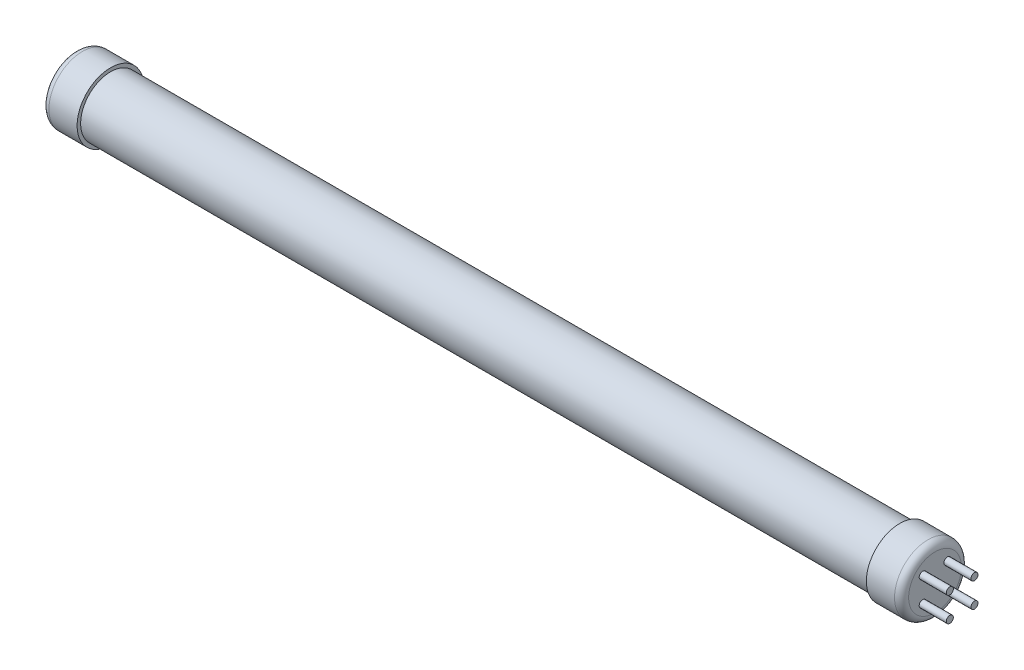
ISO-10303-21;
HEADER;
FILE_DESCRIPTION(('STEP AP214'),'2;1');
FILE_NAME('part.step','',(''),(''),'','','');
FILE_SCHEMA(('AUTOMOTIVE_DESIGN { 1 0 10303 214 1 1 1 1 }'));
ENDSEC;
DATA;
#1=APPLICATION_CONTEXT('core data for automotive mechanical design processes');
#2=APPLICATION_PROTOCOL_DEFINITION('international standard','automotive_design',2000,#1);
#3=PRODUCT_CONTEXT('',#1,'mechanical');
#4=PRODUCT('Part','Part','',(#3));
#5=PRODUCT_RELATED_PRODUCT_CATEGORY('part','',(#4));
#6=PRODUCT_DEFINITION_FORMATION('','',#4);
#7=PRODUCT_DEFINITION_CONTEXT('part definition',#1,'design');
#8=PRODUCT_DEFINITION('design','',#6,#7);
#9=PRODUCT_DEFINITION_SHAPE('','',#8);
#10=(LENGTH_UNIT() NAMED_UNIT(*) SI_UNIT(.MILLI.,.METRE.));
#11=(NAMED_UNIT(*) PLANE_ANGLE_UNIT() SI_UNIT($,.RADIAN.));
#12=(NAMED_UNIT(*) SI_UNIT($,.STERADIAN.) SOLID_ANGLE_UNIT());
#13=UNCERTAINTY_MEASURE_WITH_UNIT(LENGTH_MEASURE(1.E-05),#10,'distance_accuracy_value','');
#14=(GEOMETRIC_REPRESENTATION_CONTEXT(3) GLOBAL_UNCERTAINTY_ASSIGNED_CONTEXT((#13)) GLOBAL_UNIT_ASSIGNED_CONTEXT((#10,
#11,#12)) REPRESENTATION_CONTEXT('',''));
#15=CARTESIAN_POINT('',(0.,0.,0.));
#16=DIRECTION('',(0.,0.,1.));
#17=DIRECTION('',(1.,0.,0.));
#18=AXIS2_PLACEMENT_3D('',#15,#16,#17);
#19=CARTESIAN_POINT('',(-112.05,0.,0.));
#20=DIRECTION('',(-1.,0.,0.));
#21=DIRECTION('',(0.,0.,1.));
#22=AXIS2_PLACEMENT_3D('',#19,#20,#21);
#23=CYLINDRICAL_SURFACE('',#22,8.5);
#24=CARTESIAN_POINT('',(-112.05,0.,0.));
#25=DIRECTION('',(-1.,0.,0.));
#26=DIRECTION('',(0.,0.,1.));
#27=AXIS2_PLACEMENT_3D('',#24,#25,#26);
#28=CIRCLE('',#27,8.5);
#29=CARTESIAN_POINT('',(-112.05,0.,8.50000000000001));
#30=VERTEX_POINT('',#29);
#31=EDGE_CURVE('E53',#30,#30,#28,.T.);
#32=ORIENTED_EDGE('',*,*,#31,.F.);
#33=EDGE_LOOP('',(#32));
#34=FACE_BOUND('',#33,.T.);
#35=CARTESIAN_POINT('',(112.05,0.,0.));
#36=DIRECTION('',(-1.,0.,0.));
#37=DIRECTION('',(0.,0.,1.));
#38=AXIS2_PLACEMENT_3D('',#35,#36,#37);
#39=CIRCLE('',#38,8.5);
#40=CARTESIAN_POINT('',(112.05,0.,8.50000000000001));
#41=VERTEX_POINT('',#40);
#42=EDGE_CURVE('E57',#41,#41,#39,.T.);
#43=ORIENTED_EDGE('',*,*,#42,.T.);
#44=EDGE_LOOP('',(#43));
#45=FACE_BOUND('',#44,.T.);
#46=ADVANCED_FACE('F33',(#34,#45),#23,.T.);
#47=CARTESIAN_POINT('',(-122.05,0.,0.));
#48=DIRECTION('',(1.,0.,0.));
#49=DIRECTION('',(0.,0.,-1.));
#50=AXIS2_PLACEMENT_3D('',#47,#48,#49);
#51=CYLINDRICAL_SURFACE('',#50,9.50000000000001);
#52=CARTESIAN_POINT('',(-120.05,0.,0.));
#53=DIRECTION('',(-1.,0.,0.));
#54=DIRECTION('',(0.,0.,1.));
#55=AXIS2_PLACEMENT_3D('',#52,#53,#54);
#56=CIRCLE('',#55,9.50000000000001);
#57=CARTESIAN_POINT('',(-120.05,0.,9.50000000000001));
#58=VERTEX_POINT('',#57);
#59=EDGE_CURVE('E10',#58,#58,#56,.F.);
#60=ORIENTED_EDGE('',*,*,#59,.T.);
#61=EDGE_LOOP('',(#60));
#62=FACE_BOUND('',#61,.T.);
#63=CARTESIAN_POINT('',(-112.05,0.,0.));
#64=DIRECTION('',(-1.,0.,0.));
#65=DIRECTION('',(0.,0.,1.));
#66=AXIS2_PLACEMENT_3D('',#63,#64,#65);
#67=CIRCLE('',#66,9.50000000000001);
#68=CARTESIAN_POINT('',(-112.05,0.,9.50000000000001));
#69=VERTEX_POINT('',#68);
#70=EDGE_CURVE('E56',#69,#69,#67,.T.);
#71=ORIENTED_EDGE('',*,*,#70,.T.);
#72=EDGE_LOOP('',(#71));
#73=FACE_BOUND('',#72,.T.);
#74=ADVANCED_FACE('F131',(#62,#73),#51,.T.);
#75=CARTESIAN_POINT('',(-122.05,0.,0.));
#76=DIRECTION('',(-1.,0.,0.));
#77=DIRECTION('',(0.,0.,1.));
#78=AXIS2_PLACEMENT_3D('',#75,#76,#77);
#79=PLANE('',#78);
#80=CARTESIAN_POINT('',(-122.05,0.,0.));
#81=DIRECTION('',(-1.,0.,0.));
#82=DIRECTION('',(0.,0.,1.));
#83=AXIS2_PLACEMENT_3D('',#80,#81,#82);
#84=CIRCLE('',#83,7.50000000000001);
#85=CARTESIAN_POINT('',(-122.05,0.,7.50000000000001));
#86=VERTEX_POINT('',#85);
#87=EDGE_CURVE('E40',#86,#86,#84,.T.);
#88=ORIENTED_EDGE('',*,*,#87,.T.);
#89=EDGE_LOOP('',(#88));
#90=FACE_BOUND('',#89,.T.);
#91=ADVANCED_FACE('F137',(#90),#79,.T.);
#92=CARTESIAN_POINT('',(-112.05,0.,0.));
#93=DIRECTION('',(-1.,0.,0.));
#94=DIRECTION('',(0.,0.,1.));
#95=AXIS2_PLACEMENT_3D('',#92,#93,#94);
#96=PLANE('',#95);
#97=ORIENTED_EDGE('',*,*,#31,.T.);
#98=EDGE_LOOP('',(#97));
#99=FACE_BOUND('',#98,.T.);
#100=ORIENTED_EDGE('',*,*,#70,.F.);
#101=EDGE_LOOP('',(#100));
#102=FACE_BOUND('',#101,.T.);
#103=ADVANCED_FACE('F120',(#99,#102),#96,.F.);
#104=CARTESIAN_POINT('',(122.05,0.,0.));
#105=DIRECTION('',(-1.,0.,0.));
#106=DIRECTION('',(0.,0.,1.));
#107=AXIS2_PLACEMENT_3D('',#104,#105,#106);
#108=CYLINDRICAL_SURFACE('',#107,9.50000000000001);
#109=CARTESIAN_POINT('',(120.05,0.,0.));
#110=DIRECTION('',(1.,0.,0.));
#111=DIRECTION('',(0.,0.,-1.));
#112=AXIS2_PLACEMENT_3D('',#109,#110,#111);
#113=CIRCLE('',#112,9.50000000000001);
#114=CARTESIAN_POINT('',(120.05,0.,-9.50000000000001));
#115=VERTEX_POINT('',#114);
#116=EDGE_CURVE('E48',#115,#115,#113,.F.);
#117=ORIENTED_EDGE('',*,*,#116,.T.);
#118=EDGE_LOOP('',(#117));
#119=FACE_BOUND('',#118,.T.);
#120=CARTESIAN_POINT('',(112.05,0.,0.));
#121=DIRECTION('',(-1.,0.,0.));
#122=DIRECTION('',(0.,0.,1.));
#123=AXIS2_PLACEMENT_3D('',#120,#121,#122);
#124=CIRCLE('',#123,9.50000000000001);
#125=CARTESIAN_POINT('',(112.05,0.,9.50000000000001));
#126=VERTEX_POINT('',#125);
#127=EDGE_CURVE('E60',#126,#126,#124,.T.);
#128=ORIENTED_EDGE('',*,*,#127,.F.);
#129=EDGE_LOOP('',(#128));
#130=FACE_BOUND('',#129,.T.);
#131=ADVANCED_FACE('F103',(#119,#130),#108,.T.);
#132=CARTESIAN_POINT('',(122.05,0.,0.));
#133=DIRECTION('',(1.,0.,0.));
#134=DIRECTION('',(0.,0.,1.));
#135=AXIS2_PLACEMENT_3D('',#132,#133,#134);
#136=PLANE('',#135);
#137=CARTESIAN_POINT('',(122.05,-3.5,3.5));
#138=DIRECTION('',(1.,0.,0.));
#139=DIRECTION('',(0.,0.,-1.));
#140=AXIS2_PLACEMENT_3D('',#137,#138,#139);
#141=CIRCLE('',#140,1.);
#142=CARTESIAN_POINT('',(122.05,-3.5,4.5));
#143=VERTEX_POINT('',#142);
#144=EDGE_CURVE('E84',#143,#143,#141,.T.);
#145=ORIENTED_EDGE('',*,*,#144,.F.);
#146=EDGE_LOOP('',(#145));
#147=FACE_BOUND('',#146,.T.);
#148=CARTESIAN_POINT('',(122.05,-3.5,-3.5));
#149=DIRECTION('',(1.,0.,0.));
#150=DIRECTION('',(0.,0.,-1.));
#151=AXIS2_PLACEMENT_3D('',#148,#149,#150);
#152=CIRCLE('',#151,0.999999999999999);
#153=CARTESIAN_POINT('',(122.05,-3.5,-2.5));
#154=VERTEX_POINT('',#153);
#155=EDGE_CURVE('E78',#154,#154,#152,.T.);
#156=ORIENTED_EDGE('',*,*,#155,.F.);
#157=EDGE_LOOP('',(#156));
#158=FACE_BOUND('',#157,.T.);
#159=CARTESIAN_POINT('',(122.05,3.5,-3.5));
#160=DIRECTION('',(1.,0.,0.));
#161=DIRECTION('',(0.,0.,-1.));
#162=AXIS2_PLACEMENT_3D('',#159,#160,#161);
#163=CIRCLE('',#162,0.999999999999999);
#164=CARTESIAN_POINT('',(122.05,3.5,-2.5));
#165=VERTEX_POINT('',#164);
#166=EDGE_CURVE('E72',#165,#165,#163,.T.);
#167=ORIENTED_EDGE('',*,*,#166,.F.);
#168=EDGE_LOOP('',(#167));
#169=FACE_BOUND('',#168,.T.);
#170=CARTESIAN_POINT('',(122.05,3.5,3.5));
#171=DIRECTION('',(1.,0.,0.));
#172=DIRECTION('',(0.,0.,-1.));
#173=AXIS2_PLACEMENT_3D('',#170,#171,#172);
#174=CIRCLE('',#173,1.);
#175=CARTESIAN_POINT('',(122.05,3.5,4.5));
#176=VERTEX_POINT('',#175);
#177=EDGE_CURVE('E66',#176,#176,#174,.T.);
#178=ORIENTED_EDGE('',*,*,#177,.F.);
#179=EDGE_LOOP('',(#178));
#180=FACE_BOUND('',#179,.T.);
#181=CARTESIAN_POINT('',(122.05,0.,0.));
#182=DIRECTION('',(1.,0.,0.));
#183=DIRECTION('',(0.,0.,-1.));
#184=AXIS2_PLACEMENT_3D('',#181,#182,#183);
#185=CIRCLE('',#184,7.50000000000001);
#186=CARTESIAN_POINT('',(122.05,0.,-7.50000000000001));
#187=VERTEX_POINT('',#186);
#188=EDGE_CURVE('E44',#187,#187,#185,.T.);
#189=ORIENTED_EDGE('',*,*,#188,.T.);
#190=EDGE_LOOP('',(#189));
#191=FACE_BOUND('',#190,.T.);
#192=ADVANCED_FACE('F99',(#147,#158,#169,#180,#191),#136,.T.);
#193=CARTESIAN_POINT('',(112.05,0.,0.));
#194=DIRECTION('',(1.,0.,0.));
#195=DIRECTION('',(0.,0.,1.));
#196=AXIS2_PLACEMENT_3D('',#193,#194,#195);
#197=PLANE('',#196);
#198=ORIENTED_EDGE('',*,*,#42,.F.);
#199=EDGE_LOOP('',(#198));
#200=FACE_BOUND('',#199,.T.);
#201=ORIENTED_EDGE('',*,*,#127,.T.);
#202=EDGE_LOOP('',(#201));
#203=FACE_BOUND('',#202,.T.);
#204=ADVANCED_FACE('F102',(#200,#203),#197,.F.);
#205=CARTESIAN_POINT('',(120.05,0.,0.));
#206=DIRECTION('',(1.,0.,0.));
#207=DIRECTION('',(0.,0.,-1.));
#208=AXIS2_PLACEMENT_3D('',#205,#206,#207);
#209=TOROIDAL_SURFACE('',#208,7.50000000000001,2.);
#210=ORIENTED_EDGE('',*,*,#188,.F.);
#211=EDGE_LOOP('',(#210));
#212=FACE_BOUND('',#211,.T.);
#213=ORIENTED_EDGE('',*,*,#116,.F.);
#214=EDGE_LOOP('',(#213));
#215=FACE_BOUND('',#214,.T.);
#216=ADVANCED_FACE('F113',(#212,#215),#209,.T.);
#217=CARTESIAN_POINT('',(-120.05,0.,0.));
#218=DIRECTION('',(-1.,0.,0.));
#219=DIRECTION('',(0.,0.,1.));
#220=AXIS2_PLACEMENT_3D('',#217,#218,#219);
#221=TOROIDAL_SURFACE('',#220,7.50000000000001,2.);
#222=ORIENTED_EDGE('',*,*,#59,.F.);
#223=EDGE_LOOP('',(#222));
#224=FACE_BOUND('',#223,.T.);
#225=ORIENTED_EDGE('',*,*,#87,.F.);
#226=EDGE_LOOP('',(#225));
#227=FACE_BOUND('',#226,.T.);
#228=ADVANCED_FACE('F35',(#224,#227),#221,.T.);
#229=CARTESIAN_POINT('',(129.75,3.5,3.5));
#230=DIRECTION('',(-1.,0.,0.));
#231=DIRECTION('',(0.,0.,1.));
#232=AXIS2_PLACEMENT_3D('',#229,#230,#231);
#233=CYLINDRICAL_SURFACE('',#232,1.);
#234=CARTESIAN_POINT('',(129.75,3.5,3.5));
#235=DIRECTION('',(1.,0.,0.));
#236=DIRECTION('',(0.,0.,-1.));
#237=AXIS2_PLACEMENT_3D('',#234,#235,#236);
#238=CIRCLE('',#237,1.);
#239=CARTESIAN_POINT('',(129.75,3.5,4.5));
#240=VERTEX_POINT('',#239);
#241=EDGE_CURVE('E65',#240,#240,#238,.T.);
#242=CARTESIAN_POINT('',(129.75,3.5,4.5));
#243=CARTESIAN_POINT('',(129.669791666667,3.5,4.5));
#244=CARTESIAN_POINT('',(129.589583333333,3.5,4.5));
#245=CARTESIAN_POINT('',(129.429166666667,3.5,4.5));
#246=CARTESIAN_POINT('',(129.348958333333,3.5,4.5));
#247=CARTESIAN_POINT('',(129.188541666667,3.5,4.5));
#248=CARTESIAN_POINT('',(129.108333333333,3.5,4.5));
#249=CARTESIAN_POINT('',(128.947916666667,3.5,4.5));
#250=CARTESIAN_POINT('',(128.867708333333,3.5,4.5));
#251=CARTESIAN_POINT('',(128.707291666667,3.5,4.5));
#252=CARTESIAN_POINT('',(128.627083333333,3.5,4.5));
#253=CARTESIAN_POINT('',(128.466666666667,3.5,4.5));
#254=CARTESIAN_POINT('',(128.386458333333,3.5,4.5));
#255=CARTESIAN_POINT('',(128.226041666667,3.5,4.5));
#256=CARTESIAN_POINT('',(128.145833333333,3.5,4.5));
#257=CARTESIAN_POINT('',(127.985416666667,3.5,4.5));
#258=CARTESIAN_POINT('',(127.905208333333,3.5,4.5));
#259=CARTESIAN_POINT('',(127.744791666667,3.5,4.5));
#260=CARTESIAN_POINT('',(127.664583333333,3.5,4.5));
#261=CARTESIAN_POINT('',(127.504166666667,3.5,4.5));
#262=CARTESIAN_POINT('',(127.423958333333,3.5,4.5));
#263=CARTESIAN_POINT('',(127.263541666667,3.5,4.5));
#264=CARTESIAN_POINT('',(127.183333333333,3.5,4.5));
#265=CARTESIAN_POINT('',(127.022916666667,3.5,4.5));
#266=CARTESIAN_POINT('',(126.942708333333,3.5,4.5));
#267=CARTESIAN_POINT('',(126.782291666667,3.5,4.5));
#268=CARTESIAN_POINT('',(126.702083333333,3.5,4.5));
#269=CARTESIAN_POINT('',(126.541666666667,3.5,4.5));
#270=CARTESIAN_POINT('',(126.461458333333,3.5,4.5));
#271=CARTESIAN_POINT('',(126.301041666667,3.5,4.5));
#272=CARTESIAN_POINT('',(126.220833333333,3.5,4.5));
#273=CARTESIAN_POINT('',(126.060416666667,3.5,4.5));
#274=CARTESIAN_POINT('',(125.980208333333,3.5,4.5));
#275=CARTESIAN_POINT('',(125.819791666667,3.5,4.5));
#276=CARTESIAN_POINT('',(125.739583333333,3.5,4.5));
#277=CARTESIAN_POINT('',(125.579166666667,3.5,4.5));
#278=CARTESIAN_POINT('',(125.498958333333,3.5,4.5));
#279=CARTESIAN_POINT('',(125.338541666667,3.5,4.5));
#280=CARTESIAN_POINT('',(125.258333333333,3.5,4.5));
#281=CARTESIAN_POINT('',(125.097916666667,3.5,4.5));
#282=CARTESIAN_POINT('',(125.017708333333,3.5,4.5));
#283=CARTESIAN_POINT('',(124.857291666667,3.5,4.5));
#284=CARTESIAN_POINT('',(124.777083333333,3.5,4.5));
#285=CARTESIAN_POINT('',(124.616666666667,3.5,4.5));
#286=CARTESIAN_POINT('',(124.536458333333,3.5,4.5));
#287=CARTESIAN_POINT('',(124.376041666667,3.5,4.5));
#288=CARTESIAN_POINT('',(124.295833333333,3.5,4.5));
#289=CARTESIAN_POINT('',(124.135416666667,3.5,4.5));
#290=CARTESIAN_POINT('',(124.055208333333,3.5,4.5));
#291=CARTESIAN_POINT('',(123.894791666667,3.5,4.5));
#292=CARTESIAN_POINT('',(123.814583333333,3.5,4.5));
#293=CARTESIAN_POINT('',(123.654166666667,3.5,4.5));
#294=CARTESIAN_POINT('',(123.573958333333,3.5,4.5));
#295=CARTESIAN_POINT('',(123.413541666667,3.5,4.5));
#296=CARTESIAN_POINT('',(123.333333333333,3.5,4.5));
#297=CARTESIAN_POINT('',(123.172916666667,3.5,4.5));
#298=CARTESIAN_POINT('',(123.092708333333,3.5,4.5));
#299=CARTESIAN_POINT('',(122.932291666667,3.5,4.5));
#300=CARTESIAN_POINT('',(122.852083333333,3.5,4.5));
#301=CARTESIAN_POINT('',(122.691666666667,3.5,4.5));
#302=CARTESIAN_POINT('',(122.611458333333,3.5,4.5));
#303=CARTESIAN_POINT('',(122.451041666667,3.5,4.5));
#304=CARTESIAN_POINT('',(122.370833333333,3.5,4.5));
#305=CARTESIAN_POINT('',(122.210416666667,3.5,4.5));
#306=CARTESIAN_POINT('',(122.130208333333,3.5,4.5));
#307=CARTESIAN_POINT('',(122.05,3.5,4.5));
#308=B_SPLINE_CURVE_WITH_KNOTS('',3,(#242,#243,#244,#245,#246,#247,#248,#249,#250,#251,#252,
#253,#254,#255,#256,#257,#258,#259,#260,#261,#262,#263,#264,#265,#266,#267,#268,#269,#270,#271,
#272,#273,#274,#275,#276,#277,#278,#279,#280,#281,#282,#283,#284,#285,#286,#287,#288,#289,#290,
#291,#292,#293,#294,#295,#296,#297,#298,#299,#300,#301,#302,#303,#304,#305,#306,#307),
.UNSPECIFIED.,.F.,.F.,(4,2,2,2,2,2,2,2,2,2,2,2,2,2,2,2,2,2,2,2,2,2,2,2,2,2,2,2,2,2,2,2,4),(0.,
0.240624999999994,0.481249999999989,0.721874999999983,0.962499999999977,1.203125,
1.44374999999999,1.68437499999999,1.92499999999998,2.16562499999998,2.40625,2.64687499999999,
2.88749999999999,3.12812499999998,3.36874999999998,3.609375,3.84999999999999,4.09062499999999,
4.33124999999998,4.571875,4.81249999999998,5.05312499999999,5.29374999999999,5.53437499999999,
5.77499999999999,6.015625,6.25624999999999,6.49687499999999,6.73749999999999,6.97812499999999,
7.21875,7.45937499999999,7.7),.UNSPECIFIED.);
#309=EDGE_CURVE('BSEAM200',#240,#176,#308,.T.);
#310=ORIENTED_EDGE('',*,*,#241,.F.);
#311=ORIENTED_EDGE('',*,*,#177,.T.);
#312=ORIENTED_EDGE('',*,*,#309,.T.);
#313=ORIENTED_EDGE('',*,*,#309,.F.);
#314=EDGE_LOOP('',(#310,#312,#311,#313));
#315=FACE_BOUND('',#314,.T.);
#316=ADVANCED_FACE('F200',(#315),#233,.T.);
#317=CARTESIAN_POINT('',(129.75,3.5,3.5));
#318=DIRECTION('',(1.,0.,0.));
#319=DIRECTION('',(0.,0.,-1.));
#320=AXIS2_PLACEMENT_3D('',#317,#318,#319);
#321=PLANE('',#320);
#322=ORIENTED_EDGE('',*,*,#241,.T.);
#323=EDGE_LOOP('',(#322));
#324=FACE_BOUND('',#323,.T.);
#325=ADVANCED_FACE('F209',(#324),#321,.T.);
#326=CARTESIAN_POINT('',(129.75,3.5,-3.5));
#327=DIRECTION('',(-1.,0.,0.));
#328=DIRECTION('',(0.,0.,1.));
#329=AXIS2_PLACEMENT_3D('',#326,#327,#328);
#330=CYLINDRICAL_SURFACE('',#329,0.999999999999999);
#331=CARTESIAN_POINT('',(129.75,3.5,-3.5));
#332=DIRECTION('',(1.,0.,0.));
#333=DIRECTION('',(0.,0.,-1.));
#334=AXIS2_PLACEMENT_3D('',#331,#332,#333);
#335=CIRCLE('',#334,0.999999999999999);
#336=CARTESIAN_POINT('',(129.75,3.5,-2.5));
#337=VERTEX_POINT('',#336);
#338=EDGE_CURVE('E69',#337,#337,#335,.T.);
#339=CARTESIAN_POINT('',(129.75,3.5,-2.5));
#340=CARTESIAN_POINT('',(129.669791666667,3.5,-2.5));
#341=CARTESIAN_POINT('',(129.589583333333,3.5,-2.5));
#342=CARTESIAN_POINT('',(129.429166666667,3.5,-2.5));
#343=CARTESIAN_POINT('',(129.348958333333,3.5,-2.5));
#344=CARTESIAN_POINT('',(129.188541666667,3.5,-2.5));
#345=CARTESIAN_POINT('',(129.108333333333,3.5,-2.5));
#346=CARTESIAN_POINT('',(128.947916666667,3.5,-2.5));
#347=CARTESIAN_POINT('',(128.867708333333,3.5,-2.5));
#348=CARTESIAN_POINT('',(128.707291666667,3.5,-2.5));
#349=CARTESIAN_POINT('',(128.627083333333,3.5,-2.5));
#350=CARTESIAN_POINT('',(128.466666666667,3.5,-2.5));
#351=CARTESIAN_POINT('',(128.386458333333,3.5,-2.5));
#352=CARTESIAN_POINT('',(128.226041666667,3.5,-2.5));
#353=CARTESIAN_POINT('',(128.145833333333,3.5,-2.5));
#354=CARTESIAN_POINT('',(127.985416666667,3.5,-2.5));
#355=CARTESIAN_POINT('',(127.905208333333,3.5,-2.5));
#356=CARTESIAN_POINT('',(127.744791666667,3.5,-2.5));
#357=CARTESIAN_POINT('',(127.664583333333,3.5,-2.5));
#358=CARTESIAN_POINT('',(127.504166666667,3.5,-2.5));
#359=CARTESIAN_POINT('',(127.423958333333,3.5,-2.5));
#360=CARTESIAN_POINT('',(127.263541666667,3.5,-2.5));
#361=CARTESIAN_POINT('',(127.183333333333,3.5,-2.5));
#362=CARTESIAN_POINT('',(127.022916666667,3.5,-2.5));
#363=CARTESIAN_POINT('',(126.942708333333,3.5,-2.5));
#364=CARTESIAN_POINT('',(126.782291666667,3.5,-2.5));
#365=CARTESIAN_POINT('',(126.702083333333,3.5,-2.5));
#366=CARTESIAN_POINT('',(126.541666666667,3.5,-2.5));
#367=CARTESIAN_POINT('',(126.461458333333,3.5,-2.5));
#368=CARTESIAN_POINT('',(126.301041666667,3.5,-2.5));
#369=CARTESIAN_POINT('',(126.220833333333,3.5,-2.5));
#370=CARTESIAN_POINT('',(126.060416666667,3.5,-2.5));
#371=CARTESIAN_POINT('',(125.980208333333,3.5,-2.5));
#372=CARTESIAN_POINT('',(125.819791666667,3.5,-2.5));
#373=CARTESIAN_POINT('',(125.739583333333,3.5,-2.5));
#374=CARTESIAN_POINT('',(125.579166666667,3.5,-2.5));
#375=CARTESIAN_POINT('',(125.498958333333,3.5,-2.5));
#376=CARTESIAN_POINT('',(125.338541666667,3.5,-2.5));
#377=CARTESIAN_POINT('',(125.258333333333,3.5,-2.5));
#378=CARTESIAN_POINT('',(125.097916666667,3.5,-2.5));
#379=CARTESIAN_POINT('',(125.017708333333,3.5,-2.5));
#380=CARTESIAN_POINT('',(124.857291666667,3.5,-2.5));
#381=CARTESIAN_POINT('',(124.777083333333,3.5,-2.5));
#382=CARTESIAN_POINT('',(124.616666666667,3.5,-2.5));
#383=CARTESIAN_POINT('',(124.536458333333,3.5,-2.5));
#384=CARTESIAN_POINT('',(124.376041666667,3.5,-2.5));
#385=CARTESIAN_POINT('',(124.295833333333,3.5,-2.5));
#386=CARTESIAN_POINT('',(124.135416666667,3.5,-2.5));
#387=CARTESIAN_POINT('',(124.055208333333,3.5,-2.5));
#388=CARTESIAN_POINT('',(123.894791666667,3.5,-2.5));
#389=CARTESIAN_POINT('',(123.814583333333,3.5,-2.5));
#390=CARTESIAN_POINT('',(123.654166666667,3.5,-2.5));
#391=CARTESIAN_POINT('',(123.573958333333,3.5,-2.5));
#392=CARTESIAN_POINT('',(123.413541666667,3.5,-2.5));
#393=CARTESIAN_POINT('',(123.333333333333,3.5,-2.5));
#394=CARTESIAN_POINT('',(123.172916666667,3.5,-2.5));
#395=CARTESIAN_POINT('',(123.092708333333,3.5,-2.5));
#396=CARTESIAN_POINT('',(122.932291666667,3.5,-2.5));
#397=CARTESIAN_POINT('',(122.852083333333,3.5,-2.5));
#398=CARTESIAN_POINT('',(122.691666666667,3.5,-2.5));
#399=CARTESIAN_POINT('',(122.611458333333,3.5,-2.5));
#400=CARTESIAN_POINT('',(122.451041666667,3.5,-2.5));
#401=CARTESIAN_POINT('',(122.370833333333,3.5,-2.5));
#402=CARTESIAN_POINT('',(122.210416666667,3.5,-2.5));
#403=CARTESIAN_POINT('',(122.130208333333,3.5,-2.5));
#404=CARTESIAN_POINT('',(122.05,3.5,-2.5));
#405=B_SPLINE_CURVE_WITH_KNOTS('',3,(#339,#340,#341,#342,#343,#344,#345,#346,#347,#348,#349,
#350,#351,#352,#353,#354,#355,#356,#357,#358,#359,#360,#361,#362,#363,#364,#365,#366,#367,#368,
#369,#370,#371,#372,#373,#374,#375,#376,#377,#378,#379,#380,#381,#382,#383,#384,#385,#386,#387,
#388,#389,#390,#391,#392,#393,#394,#395,#396,#397,#398,#399,#400,#401,#402,#403,#404),
.UNSPECIFIED.,.F.,.F.,(4,2,2,2,2,2,2,2,2,2,2,2,2,2,2,2,2,2,2,2,2,2,2,2,2,2,2,2,2,2,2,2,4),(0.,
0.240624999999994,0.481249999999989,0.721874999999983,0.962499999999977,1.203125,
1.44374999999999,1.68437499999999,1.92499999999998,2.16562499999998,2.40625,2.64687499999999,
2.88749999999999,3.12812499999998,3.36874999999998,3.609375,3.84999999999999,4.09062499999999,
4.33124999999998,4.571875,4.81249999999998,5.05312499999999,5.29374999999999,5.53437499999999,
5.77499999999999,6.015625,6.25624999999999,6.49687499999999,6.73749999999999,6.97812499999999,
7.21875,7.45937499999999,7.7),.UNSPECIFIED.);
#406=EDGE_CURVE('BSEAM216',#337,#165,#405,.T.);
#407=ORIENTED_EDGE('',*,*,#338,.F.);
#408=ORIENTED_EDGE('',*,*,#166,.T.);
#409=ORIENTED_EDGE('',*,*,#406,.T.);
#410=ORIENTED_EDGE('',*,*,#406,.F.);
#411=EDGE_LOOP('',(#407,#409,#408,#410));
#412=FACE_BOUND('',#411,.T.);
#413=ADVANCED_FACE('F216',(#412),#330,.T.);
#414=CARTESIAN_POINT('',(129.75,3.5,-3.5));
#415=DIRECTION('',(1.,0.,0.));
#416=DIRECTION('',(0.,0.,-1.));
#417=AXIS2_PLACEMENT_3D('',#414,#415,#416);
#418=PLANE('',#417);
#419=ORIENTED_EDGE('',*,*,#338,.T.);
#420=EDGE_LOOP('',(#419));
#421=FACE_BOUND('',#420,.T.);
#422=ADVANCED_FACE('F224',(#421),#418,.T.);
#423=CARTESIAN_POINT('',(129.75,-3.5,-3.5));
#424=DIRECTION('',(-1.,0.,0.));
#425=DIRECTION('',(0.,0.,1.));
#426=AXIS2_PLACEMENT_3D('',#423,#424,#425);
#427=CYLINDRICAL_SURFACE('',#426,0.999999999999999);
#428=CARTESIAN_POINT('',(129.75,-3.5,-3.5));
#429=DIRECTION('',(1.,0.,0.));
#430=DIRECTION('',(0.,0.,-1.));
#431=AXIS2_PLACEMENT_3D('',#428,#429,#430);
#432=CIRCLE('',#431,0.999999999999999);
#433=CARTESIAN_POINT('',(129.75,-3.5,-2.5));
#434=VERTEX_POINT('',#433);
#435=EDGE_CURVE('E75',#434,#434,#432,.T.);
#436=CARTESIAN_POINT('',(129.75,-3.5,-2.5));
#437=CARTESIAN_POINT('',(129.669791666667,-3.5,-2.5));
#438=CARTESIAN_POINT('',(129.589583333333,-3.5,-2.5));
#439=CARTESIAN_POINT('',(129.429166666667,-3.5,-2.5));
#440=CARTESIAN_POINT('',(129.348958333333,-3.5,-2.5));
#441=CARTESIAN_POINT('',(129.188541666667,-3.5,-2.5));
#442=CARTESIAN_POINT('',(129.108333333333,-3.5,-2.5));
#443=CARTESIAN_POINT('',(128.947916666667,-3.5,-2.5));
#444=CARTESIAN_POINT('',(128.867708333333,-3.5,-2.5));
#445=CARTESIAN_POINT('',(128.707291666667,-3.5,-2.5));
#446=CARTESIAN_POINT('',(128.627083333333,-3.5,-2.5));
#447=CARTESIAN_POINT('',(128.466666666667,-3.5,-2.5));
#448=CARTESIAN_POINT('',(128.386458333333,-3.5,-2.5));
#449=CARTESIAN_POINT('',(128.226041666667,-3.5,-2.5));
#450=CARTESIAN_POINT('',(128.145833333333,-3.5,-2.5));
#451=CARTESIAN_POINT('',(127.985416666667,-3.5,-2.5));
#452=CARTESIAN_POINT('',(127.905208333333,-3.5,-2.5));
#453=CARTESIAN_POINT('',(127.744791666667,-3.5,-2.5));
#454=CARTESIAN_POINT('',(127.664583333333,-3.5,-2.5));
#455=CARTESIAN_POINT('',(127.504166666667,-3.5,-2.5));
#456=CARTESIAN_POINT('',(127.423958333333,-3.5,-2.5));
#457=CARTESIAN_POINT('',(127.263541666667,-3.5,-2.5));
#458=CARTESIAN_POINT('',(127.183333333333,-3.5,-2.5));
#459=CARTESIAN_POINT('',(127.022916666667,-3.5,-2.5));
#460=CARTESIAN_POINT('',(126.942708333333,-3.5,-2.5));
#461=CARTESIAN_POINT('',(126.782291666667,-3.5,-2.5));
#462=CARTESIAN_POINT('',(126.702083333333,-3.5,-2.5));
#463=CARTESIAN_POINT('',(126.541666666667,-3.5,-2.5));
#464=CARTESIAN_POINT('',(126.461458333333,-3.5,-2.5));
#465=CARTESIAN_POINT('',(126.301041666667,-3.5,-2.5));
#466=CARTESIAN_POINT('',(126.220833333333,-3.5,-2.5));
#467=CARTESIAN_POINT('',(126.060416666667,-3.5,-2.5));
#468=CARTESIAN_POINT('',(125.980208333333,-3.5,-2.5));
#469=CARTESIAN_POINT('',(125.819791666667,-3.5,-2.5));
#470=CARTESIAN_POINT('',(125.739583333333,-3.5,-2.5));
#471=CARTESIAN_POINT('',(125.579166666667,-3.5,-2.5));
#472=CARTESIAN_POINT('',(125.498958333333,-3.5,-2.5));
#473=CARTESIAN_POINT('',(125.338541666667,-3.5,-2.5));
#474=CARTESIAN_POINT('',(125.258333333333,-3.5,-2.5));
#475=CARTESIAN_POINT('',(125.097916666667,-3.5,-2.5));
#476=CARTESIAN_POINT('',(125.017708333333,-3.5,-2.5));
#477=CARTESIAN_POINT('',(124.857291666667,-3.5,-2.5));
#478=CARTESIAN_POINT('',(124.777083333333,-3.5,-2.5));
#479=CARTESIAN_POINT('',(124.616666666667,-3.5,-2.5));
#480=CARTESIAN_POINT('',(124.536458333333,-3.5,-2.5));
#481=CARTESIAN_POINT('',(124.376041666667,-3.5,-2.5));
#482=CARTESIAN_POINT('',(124.295833333333,-3.5,-2.5));
#483=CARTESIAN_POINT('',(124.135416666667,-3.5,-2.5));
#484=CARTESIAN_POINT('',(124.055208333333,-3.5,-2.5));
#485=CARTESIAN_POINT('',(123.894791666667,-3.5,-2.5));
#486=CARTESIAN_POINT('',(123.814583333333,-3.5,-2.5));
#487=CARTESIAN_POINT('',(123.654166666667,-3.5,-2.5));
#488=CARTESIAN_POINT('',(123.573958333333,-3.5,-2.5));
#489=CARTESIAN_POINT('',(123.413541666667,-3.5,-2.5));
#490=CARTESIAN_POINT('',(123.333333333333,-3.5,-2.5));
#491=CARTESIAN_POINT('',(123.172916666667,-3.5,-2.5));
#492=CARTESIAN_POINT('',(123.092708333333,-3.5,-2.5));
#493=CARTESIAN_POINT('',(122.932291666667,-3.5,-2.5));
#494=CARTESIAN_POINT('',(122.852083333333,-3.5,-2.5));
#495=CARTESIAN_POINT('',(122.691666666667,-3.5,-2.5));
#496=CARTESIAN_POINT('',(122.611458333333,-3.5,-2.5));
#497=CARTESIAN_POINT('',(122.451041666667,-3.5,-2.5));
#498=CARTESIAN_POINT('',(122.370833333333,-3.5,-2.5));
#499=CARTESIAN_POINT('',(122.210416666667,-3.5,-2.5));
#500=CARTESIAN_POINT('',(122.130208333333,-3.5,-2.5));
#501=CARTESIAN_POINT('',(122.05,-3.5,-2.5));
#502=B_SPLINE_CURVE_WITH_KNOTS('',3,(#436,#437,#438,#439,#440,#441,#442,#443,#444,#445,#446,
#447,#448,#449,#450,#451,#452,#453,#454,#455,#456,#457,#458,#459,#460,#461,#462,#463,#464,#465,
#466,#467,#468,#469,#470,#471,#472,#473,#474,#475,#476,#477,#478,#479,#480,#481,#482,#483,#484,
#485,#486,#487,#488,#489,#490,#491,#492,#493,#494,#495,#496,#497,#498,#499,#500,#501),
.UNSPECIFIED.,.F.,.F.,(4,2,2,2,2,2,2,2,2,2,2,2,2,2,2,2,2,2,2,2,2,2,2,2,2,2,2,2,2,2,2,2,4),(0.,
0.240624999999994,0.481249999999989,0.721874999999983,0.962499999999977,1.203125,
1.44374999999999,1.68437499999999,1.92499999999998,2.16562499999998,2.40625,2.64687499999999,
2.88749999999999,3.12812499999998,3.36874999999998,3.609375,3.84999999999999,4.09062499999999,
4.33124999999998,4.571875,4.81249999999998,5.05312499999999,5.29374999999999,5.53437499999999,
5.77499999999999,6.015625,6.25624999999999,6.49687499999999,6.73749999999999,6.97812499999999,
7.21875,7.45937499999999,7.7),.UNSPECIFIED.);
#503=EDGE_CURVE('BSEAM232',#434,#154,#502,.T.);
#504=ORIENTED_EDGE('',*,*,#435,.F.);
#505=ORIENTED_EDGE('',*,*,#155,.T.);
#506=ORIENTED_EDGE('',*,*,#503,.T.);
#507=ORIENTED_EDGE('',*,*,#503,.F.);
#508=EDGE_LOOP('',(#504,#506,#505,#507));
#509=FACE_BOUND('',#508,.T.);
#510=ADVANCED_FACE('F232',(#509),#427,.T.);
#511=CARTESIAN_POINT('',(129.75,-3.5,-3.5));
#512=DIRECTION('',(1.,0.,0.));
#513=DIRECTION('',(0.,0.,-1.));
#514=AXIS2_PLACEMENT_3D('',#511,#512,#513);
#515=PLANE('',#514);
#516=ORIENTED_EDGE('',*,*,#435,.T.);
#517=EDGE_LOOP('',(#516));
#518=FACE_BOUND('',#517,.T.);
#519=ADVANCED_FACE('F95',(#518),#515,.T.);
#520=CARTESIAN_POINT('',(129.75,-3.5,3.5));
#521=DIRECTION('',(-1.,0.,0.));
#522=DIRECTION('',(0.,0.,1.));
#523=AXIS2_PLACEMENT_3D('',#520,#521,#522);
#524=CYLINDRICAL_SURFACE('',#523,1.);
#525=CARTESIAN_POINT('',(129.75,-3.5,3.5));
#526=DIRECTION('',(1.,0.,0.));
#527=DIRECTION('',(0.,0.,-1.));
#528=AXIS2_PLACEMENT_3D('',#525,#526,#527);
#529=CIRCLE('',#528,1.);
#530=CARTESIAN_POINT('',(129.75,-3.5,4.5));
#531=VERTEX_POINT('',#530);
#532=EDGE_CURVE('E81',#531,#531,#529,.T.);
#533=CARTESIAN_POINT('',(129.75,-3.5,4.5));
#534=CARTESIAN_POINT('',(129.669791666667,-3.5,4.5));
#535=CARTESIAN_POINT('',(129.589583333333,-3.5,4.5));
#536=CARTESIAN_POINT('',(129.429166666667,-3.5,4.5));
#537=CARTESIAN_POINT('',(129.348958333333,-3.5,4.5));
#538=CARTESIAN_POINT('',(129.188541666667,-3.5,4.5));
#539=CARTESIAN_POINT('',(129.108333333333,-3.5,4.5));
#540=CARTESIAN_POINT('',(128.947916666667,-3.5,4.5));
#541=CARTESIAN_POINT('',(128.867708333333,-3.5,4.5));
#542=CARTESIAN_POINT('',(128.707291666667,-3.5,4.5));
#543=CARTESIAN_POINT('',(128.627083333333,-3.5,4.5));
#544=CARTESIAN_POINT('',(128.466666666667,-3.5,4.5));
#545=CARTESIAN_POINT('',(128.386458333333,-3.5,4.5));
#546=CARTESIAN_POINT('',(128.226041666667,-3.5,4.5));
#547=CARTESIAN_POINT('',(128.145833333333,-3.5,4.5));
#548=CARTESIAN_POINT('',(127.985416666667,-3.5,4.5));
#549=CARTESIAN_POINT('',(127.905208333333,-3.5,4.5));
#550=CARTESIAN_POINT('',(127.744791666667,-3.5,4.5));
#551=CARTESIAN_POINT('',(127.664583333333,-3.5,4.5));
#552=CARTESIAN_POINT('',(127.504166666667,-3.5,4.5));
#553=CARTESIAN_POINT('',(127.423958333333,-3.5,4.5));
#554=CARTESIAN_POINT('',(127.263541666667,-3.5,4.5));
#555=CARTESIAN_POINT('',(127.183333333333,-3.5,4.5));
#556=CARTESIAN_POINT('',(127.022916666667,-3.5,4.5));
#557=CARTESIAN_POINT('',(126.942708333333,-3.5,4.5));
#558=CARTESIAN_POINT('',(126.782291666667,-3.5,4.5));
#559=CARTESIAN_POINT('',(126.702083333333,-3.5,4.5));
#560=CARTESIAN_POINT('',(126.541666666667,-3.5,4.5));
#561=CARTESIAN_POINT('',(126.461458333333,-3.5,4.5));
#562=CARTESIAN_POINT('',(126.301041666667,-3.5,4.5));
#563=CARTESIAN_POINT('',(126.220833333333,-3.5,4.5));
#564=CARTESIAN_POINT('',(126.060416666667,-3.5,4.5));
#565=CARTESIAN_POINT('',(125.980208333333,-3.5,4.5));
#566=CARTESIAN_POINT('',(125.819791666667,-3.5,4.5));
#567=CARTESIAN_POINT('',(125.739583333333,-3.5,4.5));
#568=CARTESIAN_POINT('',(125.579166666667,-3.5,4.5));
#569=CARTESIAN_POINT('',(125.498958333333,-3.5,4.5));
#570=CARTESIAN_POINT('',(125.338541666667,-3.5,4.5));
#571=CARTESIAN_POINT('',(125.258333333333,-3.5,4.5));
#572=CARTESIAN_POINT('',(125.097916666667,-3.5,4.5));
#573=CARTESIAN_POINT('',(125.017708333333,-3.5,4.5));
#574=CARTESIAN_POINT('',(124.857291666667,-3.5,4.5));
#575=CARTESIAN_POINT('',(124.777083333333,-3.5,4.5));
#576=CARTESIAN_POINT('',(124.616666666667,-3.5,4.5));
#577=CARTESIAN_POINT('',(124.536458333333,-3.5,4.5));
#578=CARTESIAN_POINT('',(124.376041666667,-3.5,4.5));
#579=CARTESIAN_POINT('',(124.295833333333,-3.5,4.5));
#580=CARTESIAN_POINT('',(124.135416666667,-3.5,4.5));
#581=CARTESIAN_POINT('',(124.055208333333,-3.5,4.5));
#582=CARTESIAN_POINT('',(123.894791666667,-3.5,4.5));
#583=CARTESIAN_POINT('',(123.814583333333,-3.5,4.5));
#584=CARTESIAN_POINT('',(123.654166666667,-3.5,4.5));
#585=CARTESIAN_POINT('',(123.573958333333,-3.5,4.5));
#586=CARTESIAN_POINT('',(123.413541666667,-3.5,4.5));
#587=CARTESIAN_POINT('',(123.333333333333,-3.5,4.5));
#588=CARTESIAN_POINT('',(123.172916666667,-3.5,4.5));
#589=CARTESIAN_POINT('',(123.092708333333,-3.5,4.5));
#590=CARTESIAN_POINT('',(122.932291666667,-3.5,4.5));
#591=CARTESIAN_POINT('',(122.852083333333,-3.5,4.5));
#592=CARTESIAN_POINT('',(122.691666666667,-3.5,4.5));
#593=CARTESIAN_POINT('',(122.611458333333,-3.5,4.5));
#594=CARTESIAN_POINT('',(122.451041666667,-3.5,4.5));
#595=CARTESIAN_POINT('',(122.370833333333,-3.5,4.5));
#596=CARTESIAN_POINT('',(122.210416666667,-3.5,4.5));
#597=CARTESIAN_POINT('',(122.130208333333,-3.5,4.5));
#598=CARTESIAN_POINT('',(122.05,-3.5,4.5));
#599=B_SPLINE_CURVE_WITH_KNOTS('',3,(#533,#534,#535,#536,#537,#538,#539,#540,#541,#542,#543,
#544,#545,#546,#547,#548,#549,#550,#551,#552,#553,#554,#555,#556,#557,#558,#559,#560,#561,#562,
#563,#564,#565,#566,#567,#568,#569,#570,#571,#572,#573,#574,#575,#576,#577,#578,#579,#580,#581,
#582,#583,#584,#585,#586,#587,#588,#589,#590,#591,#592,#593,#594,#595,#596,#597,#598),
.UNSPECIFIED.,.F.,.F.,(4,2,2,2,2,2,2,2,2,2,2,2,2,2,2,2,2,2,2,2,2,2,2,2,2,2,2,2,2,2,2,2,4),(0.,
0.240624999999994,0.481249999999989,0.721874999999983,0.962499999999977,1.203125,
1.44374999999999,1.68437499999999,1.92499999999998,2.16562499999998,2.40625,2.64687499999999,
2.88749999999999,3.12812499999998,3.36874999999998,3.609375,3.84999999999999,4.09062499999999,
4.33124999999998,4.571875,4.81249999999998,5.05312499999999,5.29374999999999,5.53437499999999,
5.77499999999999,6.015625,6.25624999999999,6.49687499999999,6.73749999999999,6.97812499999999,
7.21875,7.45937499999999,7.7),.UNSPECIFIED.);
#600=EDGE_CURVE('BSEAM92',#531,#143,#599,.T.);
#601=ORIENTED_EDGE('',*,*,#532,.F.);
#602=ORIENTED_EDGE('',*,*,#144,.T.);
#603=ORIENTED_EDGE('',*,*,#600,.T.);
#604=ORIENTED_EDGE('',*,*,#600,.F.);
#605=EDGE_LOOP('',(#601,#603,#602,#604));
#606=FACE_BOUND('',#605,.T.);
#607=ADVANCED_FACE('F92',(#606),#524,.T.);
#608=CARTESIAN_POINT('',(129.75,-3.5,3.5));
#609=DIRECTION('',(1.,0.,0.));
#610=DIRECTION('',(0.,0.,-1.));
#611=AXIS2_PLACEMENT_3D('',#608,#609,#610);
#612=PLANE('',#611);
#613=ORIENTED_EDGE('',*,*,#532,.T.);
#614=EDGE_LOOP('',(#613));
#615=FACE_BOUND('',#614,.T.);
#616=ADVANCED_FACE('F90',(#615),#612,.T.);
#617=CLOSED_SHELL('',(#46,#74,#91,#103,#131,#192,#204,#216,#228,#316,#325,#413,#422,#510,#519,
#607,#616));
#618=MANIFOLD_SOLID_BREP('B2',#617);
#619=ADVANCED_BREP_SHAPE_REPRESENTATION('',(#18,#618),#14);
#620=SHAPE_DEFINITION_REPRESENTATION(#9,#619);
ENDSEC;
END-ISO-10303-21;
